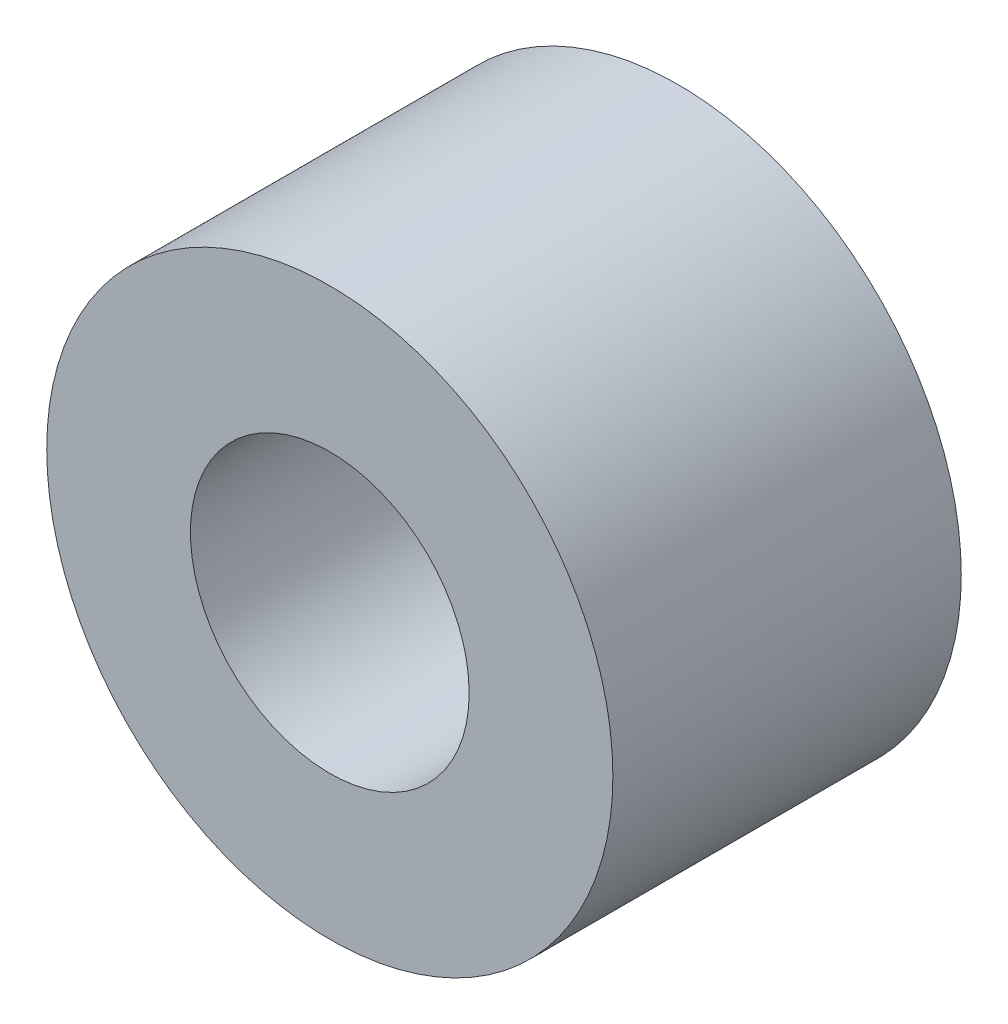
ISO-10303-21;
HEADER;
FILE_DESCRIPTION(('STEP AP214'),'2;1');
FILE_NAME('part.step','',(''),(''),'','','');
FILE_SCHEMA(('AUTOMOTIVE_DESIGN { 1 0 10303 214 1 1 1 1 }'));
ENDSEC;
DATA;
#1=APPLICATION_CONTEXT('core data for automotive mechanical design processes');
#2=APPLICATION_PROTOCOL_DEFINITION('international standard','automotive_design',2000,#1);
#3=PRODUCT_CONTEXT('',#1,'mechanical');
#4=PRODUCT('Part','Part','',(#3));
#5=PRODUCT_RELATED_PRODUCT_CATEGORY('part','',(#4));
#6=PRODUCT_DEFINITION_FORMATION('','',#4);
#7=PRODUCT_DEFINITION_CONTEXT('part definition',#1,'design');
#8=PRODUCT_DEFINITION('design','',#6,#7);
#9=PRODUCT_DEFINITION_SHAPE('','',#8);
#10=(LENGTH_UNIT() NAMED_UNIT(*) SI_UNIT(.MILLI.,.METRE.));
#11=(NAMED_UNIT(*) PLANE_ANGLE_UNIT() SI_UNIT($,.RADIAN.));
#12=(NAMED_UNIT(*) SI_UNIT($,.STERADIAN.) SOLID_ANGLE_UNIT());
#13=UNCERTAINTY_MEASURE_WITH_UNIT(LENGTH_MEASURE(1.E-05),#10,'distance_accuracy_value','');
#14=(GEOMETRIC_REPRESENTATION_CONTEXT(3) GLOBAL_UNCERTAINTY_ASSIGNED_CONTEXT((#13)) GLOBAL_UNIT_ASSIGNED_CONTEXT((#10,
#11,#12)) REPRESENTATION_CONTEXT('',''));
#15=CARTESIAN_POINT('',(0.,0.,0.));
#16=DIRECTION('',(0.,0.,1.));
#17=DIRECTION('',(1.,0.,0.));
#18=AXIS2_PLACEMENT_3D('',#15,#16,#17);
#19=CARTESIAN_POINT('',(0.,0.,13.1923881554251));
#20=DIRECTION('',(0.,0.,-1.));
#21=DIRECTION('',(-1.,0.,0.));
#22=AXIS2_PLACEMENT_3D('',#19,#20,#21);
#23=CYLINDRICAL_SURFACE('',#22,3.25);
#24=CARTESIAN_POINT('',(0.,0.,0.));
#25=DIRECTION('',(0.,0.,1.));
#26=DIRECTION('',(1.,0.,0.));
#27=AXIS2_PLACEMENT_3D('',#24,#25,#26);
#28=CIRCLE('',#27,3.25);
#29=CARTESIAN_POINT('',(3.25,0.,0.));
#30=VERTEX_POINT('',#29);
#31=EDGE_CURVE('E42',#30,#30,#28,.T.);
#32=ORIENTED_EDGE('',*,*,#31,.T.);
#33=EDGE_LOOP('',(#32));
#34=FACE_BOUND('',#33,.T.);
#35=CARTESIAN_POINT('',(0.,0.,4.00000000000001));
#36=DIRECTION('',(0.,0.,1.));
#37=DIRECTION('',(1.,0.,0.));
#38=AXIS2_PLACEMENT_3D('',#35,#36,#37);
#39=CIRCLE('',#38,3.25);
#40=CARTESIAN_POINT('',(3.25,0.,4.00000000000001));
#41=VERTEX_POINT('',#40);
#42=EDGE_CURVE('E10',#41,#41,#39,.T.);
#43=ORIENTED_EDGE('',*,*,#42,.F.);
#44=EDGE_LOOP('',(#43));
#45=FACE_BOUND('',#44,.T.);
#46=ADVANCED_FACE('F34',(#34,#45),#23,.T.);
#47=CARTESIAN_POINT('',(0.,0.,0.));
#48=DIRECTION('',(0.,0.,1.));
#49=DIRECTION('',(1.,0.,0.));
#50=AXIS2_PLACEMENT_3D('',#47,#48,#49);
#51=PLANE('',#50);
#52=ORIENTED_EDGE('',*,*,#31,.F.);
#53=EDGE_LOOP('',(#52));
#54=FACE_BOUND('',#53,.T.);
#55=CARTESIAN_POINT('',(0.,0.,0.));
#56=DIRECTION('',(0.,0.,1.));
#57=DIRECTION('',(1.,0.,0.));
#58=AXIS2_PLACEMENT_3D('',#55,#56,#57);
#59=CIRCLE('',#58,1.6);
#60=CARTESIAN_POINT('',(1.6,0.,0.));
#61=VERTEX_POINT('',#60);
#62=EDGE_CURVE('E49',#61,#61,#59,.T.);
#63=ORIENTED_EDGE('',*,*,#62,.T.);
#64=EDGE_LOOP('',(#63));
#65=FACE_BOUND('',#64,.T.);
#66=ADVANCED_FACE('F66',(#54,#65),#51,.F.);
#67=CARTESIAN_POINT('',(0.,0.,13.1923881554251));
#68=DIRECTION('',(0.,0.,-1.));
#69=DIRECTION('',(-1.,0.,0.));
#70=AXIS2_PLACEMENT_3D('',#67,#68,#69);
#71=CYLINDRICAL_SURFACE('',#70,1.6);
#72=ORIENTED_EDGE('',*,*,#62,.F.);
#73=EDGE_LOOP('',(#72));
#74=FACE_BOUND('',#73,.T.);
#75=CARTESIAN_POINT('',(0.,0.,4.00000000000001));
#76=DIRECTION('',(0.,0.,1.));
#77=DIRECTION('',(1.,0.,0.));
#78=AXIS2_PLACEMENT_3D('',#75,#76,#77);
#79=CIRCLE('',#78,1.6);
#80=CARTESIAN_POINT('',(1.6,0.,4.00000000000001));
#81=VERTEX_POINT('',#80);
#82=EDGE_CURVE('E37',#81,#81,#79,.T.);
#83=ORIENTED_EDGE('',*,*,#82,.T.);
#84=EDGE_LOOP('',(#83));
#85=FACE_BOUND('',#84,.T.);
#86=ADVANCED_FACE('F58',(#74,#85),#71,.F.);
#87=CARTESIAN_POINT('',(19.9962835538121,-45.8211332033108,4.));
#88=DIRECTION('',(0.,0.,1.));
#89=DIRECTION('',(1.,0.,0.));
#90=AXIS2_PLACEMENT_3D('',#87,#88,#89);
#91=PLANE('',#90);
#92=ORIENTED_EDGE('',*,*,#82,.F.);
#93=EDGE_LOOP('',(#92));
#94=FACE_BOUND('',#93,.T.);
#95=ORIENTED_EDGE('',*,*,#42,.T.);
#96=EDGE_LOOP('',(#95));
#97=FACE_BOUND('',#96,.T.);
#98=ADVANCED_FACE('F60',(#94,#97),#91,.T.);
#99=CLOSED_SHELL('',(#46,#66,#86,#98));
#100=MANIFOLD_SOLID_BREP('B2',#99);
#101=ADVANCED_BREP_SHAPE_REPRESENTATION('',(#18,#100),#14);
#102=SHAPE_DEFINITION_REPRESENTATION(#9,#101);
ENDSEC;
END-ISO-10303-21;
